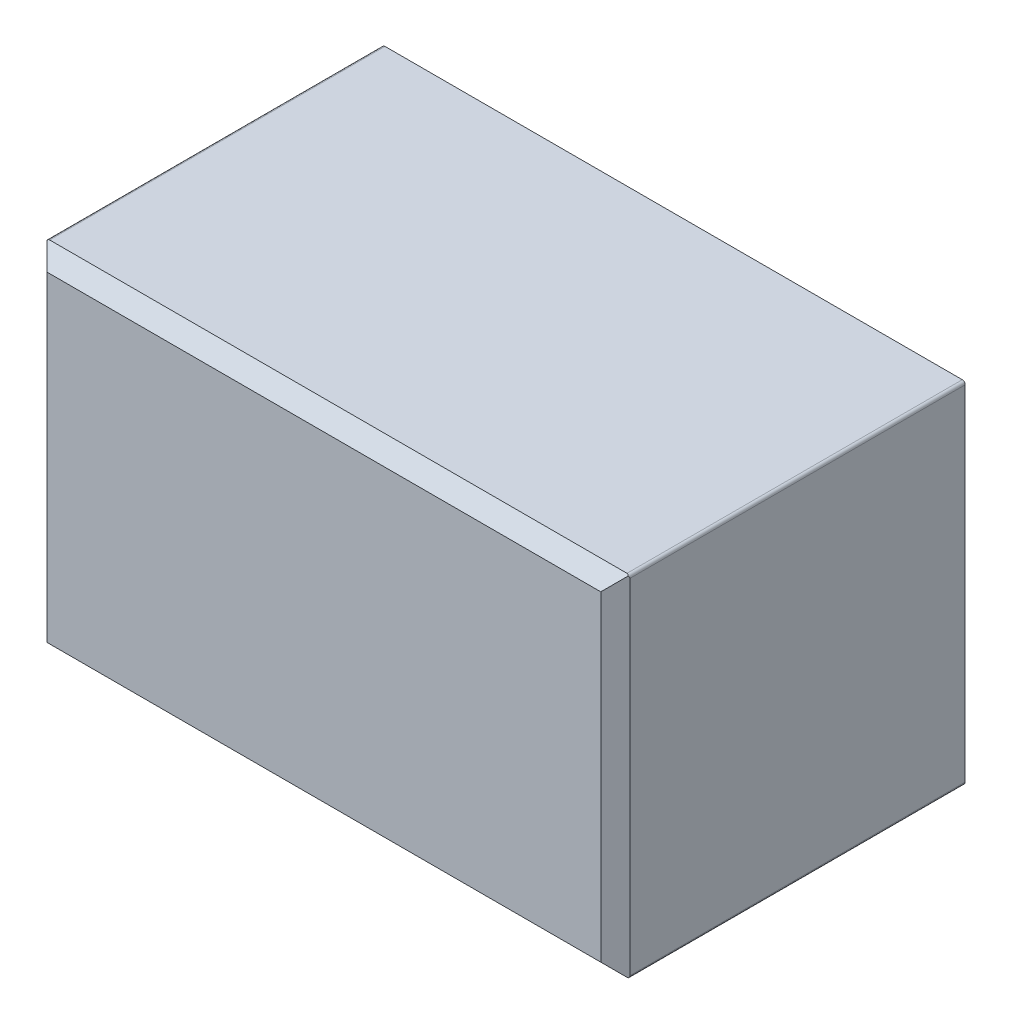
ISO-10303-21;
HEADER;
FILE_DESCRIPTION(('STEP AP214'),'2;1');
FILE_NAME('part.step','',(''),(''),'','','');
FILE_SCHEMA(('AUTOMOTIVE_DESIGN { 1 0 10303 214 1 1 1 1 }'));
ENDSEC;
DATA;
#1=APPLICATION_CONTEXT('core data for automotive mechanical design processes');
#2=APPLICATION_PROTOCOL_DEFINITION('international standard','automotive_design',2000,#1);
#3=PRODUCT_CONTEXT('',#1,'mechanical');
#4=PRODUCT('Part','Part','',(#3));
#5=PRODUCT_RELATED_PRODUCT_CATEGORY('part','',(#4));
#6=PRODUCT_DEFINITION_FORMATION('','',#4);
#7=PRODUCT_DEFINITION_CONTEXT('part definition',#1,'design');
#8=PRODUCT_DEFINITION('design','',#6,#7);
#9=PRODUCT_DEFINITION_SHAPE('','',#8);
#10=(LENGTH_UNIT() NAMED_UNIT(*) SI_UNIT(.MILLI.,.METRE.));
#11=(NAMED_UNIT(*) PLANE_ANGLE_UNIT() SI_UNIT($,.RADIAN.));
#12=(NAMED_UNIT(*) SI_UNIT($,.STERADIAN.) SOLID_ANGLE_UNIT());
#13=UNCERTAINTY_MEASURE_WITH_UNIT(LENGTH_MEASURE(1.E-05),#10,'distance_accuracy_value','');
#14=(GEOMETRIC_REPRESENTATION_CONTEXT(3) GLOBAL_UNCERTAINTY_ASSIGNED_CONTEXT((#13)) GLOBAL_UNIT_ASSIGNED_CONTEXT((#10,
#11,#12)) REPRESENTATION_CONTEXT('',''));
#15=CARTESIAN_POINT('',(0.,0.,0.));
#16=DIRECTION('',(0.,0.,1.));
#17=DIRECTION('',(1.,0.,0.));
#18=AXIS2_PLACEMENT_3D('',#15,#16,#17);
#19=CARTESIAN_POINT('',(-1.06842105263158,0.681578947368422,1.2));
#20=DIRECTION('',(1.,0.,0.));
#21=DIRECTION('',(0.,0.,-1.));
#22=AXIS2_PLACEMENT_3D('',#19,#20,#21);
#23=PLANE('',#22);
#24=DIRECTION('',(0.,1.,0.));
#25=VECTOR('',#24,1.);
#26=CARTESIAN_POINT('',(-1.06842105263158,0.681578947368422,1.15));
#27=LINE('',#26,#25);
#28=CARTESIAN_POINT('',(-1.06842105263158,-0.508421052631579,1.15));
#29=VERTEX_POINT('',#28);
#30=CARTESIAN_POINT('',(-1.06842105263158,0.671578947368422,1.15));
#31=VERTEX_POINT('',#30);
#32=EDGE_CURVE('E177',#29,#31,#27,.T.);
#33=ORIENTED_EDGE('',*,*,#32,.T.);
#34=DIRECTION('',(0.,0.,-1.));
#35=VECTOR('',#34,1.);
#36=CARTESIAN_POINT('',(-1.06842105263158,0.671578947368422,1.2));
#37=LINE('',#36,#35);
#38=CARTESIAN_POINT('',(-1.06842105263158,0.671578947368422,0.));
#39=VERTEX_POINT('',#38);
#40=EDGE_CURVE('E194',#31,#39,#37,.T.);
#41=ORIENTED_EDGE('',*,*,#40,.T.);
#42=DIRECTION('',(0.,-1.,0.));
#43=VECTOR('',#42,1.);
#44=CARTESIAN_POINT('',(-1.06842105263158,0.681578947368422,0.));
#45=LINE('',#44,#43);
#46=CARTESIAN_POINT('',(-1.06842105263158,-0.508421052631579,0.));
#47=VERTEX_POINT('',#46);
#48=EDGE_CURVE('E148',#39,#47,#45,.T.);
#49=ORIENTED_EDGE('',*,*,#48,.T.);
#50=DIRECTION('',(0.,0.,-1.));
#51=VECTOR('',#50,1.);
#52=CARTESIAN_POINT('',(-1.06842105263158,-0.508421052631579,1.2));
#53=LINE('',#52,#51);
#54=EDGE_CURVE('E184',#47,#29,#53,.F.);
#55=ORIENTED_EDGE('',*,*,#54,.T.);
#56=EDGE_LOOP('',(#33,#41,#49,#55));
#57=FACE_BOUND('',#56,.T.);
#58=ADVANCED_FACE('F39',(#57),#23,.F.);
#59=CARTESIAN_POINT('',(-1.06842105263158,-0.518421052631579,1.2));
#60=DIRECTION('',(0.,1.,0.));
#61=DIRECTION('',(0.,0.,1.));
#62=AXIS2_PLACEMENT_3D('',#59,#60,#61);
#63=PLANE('',#62);
#64=DIRECTION('',(1.,0.,0.));
#65=VECTOR('',#64,1.);
#66=CARTESIAN_POINT('',(-1.06842105263158,-0.518421052631579,0.));
#67=LINE('',#66,#65);
#68=CARTESIAN_POINT('',(-1.05842105263158,-0.518421052631579,0.));
#69=VERTEX_POINT('',#68);
#70=CARTESIAN_POINT('',(0.921578947368421,-0.518421052631579,0.));
#71=VERTEX_POINT('',#70);
#72=EDGE_CURVE('E250',#69,#71,#67,.T.);
#73=ORIENTED_EDGE('',*,*,#72,.T.);
#74=DIRECTION('',(0.,0.,-1.));
#75=VECTOR('',#74,1.);
#76=CARTESIAN_POINT('',(0.921578947368421,-0.518421052631579,1.2));
#77=LINE('',#76,#75);
#78=CARTESIAN_POINT('',(0.921578947368421,-0.518421052631579,1.15));
#79=VERTEX_POINT('',#78);
#80=EDGE_CURVE('E61',#71,#79,#77,.F.);
#81=ORIENTED_EDGE('',*,*,#80,.T.);
#82=DIRECTION('',(-1.,0.,0.));
#83=VECTOR('',#82,1.);
#84=CARTESIAN_POINT('',(-1.06842105263158,-0.518421052631579,1.15));
#85=LINE('',#84,#83);
#86=CARTESIAN_POINT('',(-1.05842105263158,-0.518421052631579,1.15));
#87=VERTEX_POINT('',#86);
#88=EDGE_CURVE('E181',#79,#87,#85,.T.);
#89=ORIENTED_EDGE('',*,*,#88,.T.);
#90=DIRECTION('',(0.,0.,-1.));
#91=VECTOR('',#90,1.);
#92=CARTESIAN_POINT('',(-1.05842105263158,-0.518421052631579,1.2));
#93=LINE('',#92,#91);
#94=EDGE_CURVE('E241',#87,#69,#93,.T.);
#95=ORIENTED_EDGE('',*,*,#94,.T.);
#96=EDGE_LOOP('',(#73,#81,#89,#95));
#97=FACE_BOUND('',#96,.T.);
#98=ADVANCED_FACE('F249',(#97),#63,.F.);
#99=CARTESIAN_POINT('',(0.931578947368421,0.681578947368422,1.2));
#100=DIRECTION('',(-1.,0.,0.));
#101=DIRECTION('',(0.,-1.,0.));
#102=AXIS2_PLACEMENT_3D('',#99,#100,#101);
#103=PLANE('',#102);
#104=DIRECTION('',(0.,1.,0.));
#105=VECTOR('',#104,1.);
#106=CARTESIAN_POINT('',(0.931578947368421,0.681578947368422,0.));
#107=LINE('',#106,#105);
#108=CARTESIAN_POINT('',(0.931578947368421,-0.508421052631579,0.));
#109=VERTEX_POINT('',#108);
#110=CARTESIAN_POINT('',(0.931578947368421,0.671578947368422,0.));
#111=VERTEX_POINT('',#110);
#112=EDGE_CURVE('E160',#109,#111,#107,.T.);
#113=ORIENTED_EDGE('',*,*,#112,.T.);
#114=DIRECTION('',(0.,0.,-1.));
#115=VECTOR('',#114,1.);
#116=CARTESIAN_POINT('',(0.931578947368421,0.671578947368422,1.2));
#117=LINE('',#116,#115);
#118=CARTESIAN_POINT('',(0.931578947368421,0.671578947368422,1.15));
#119=VERTEX_POINT('',#118);
#120=EDGE_CURVE('E232',#111,#119,#117,.F.);
#121=ORIENTED_EDGE('',*,*,#120,.T.);
#122=DIRECTION('',(0.,-1.,0.));
#123=VECTOR('',#122,1.);
#124=CARTESIAN_POINT('',(0.931578947368421,-0.518421052631579,1.15));
#125=LINE('',#124,#123);
#126=CARTESIAN_POINT('',(0.931578947368421,-0.508421052631579,1.15));
#127=VERTEX_POINT('',#126);
#128=EDGE_CURVE('E169',#119,#127,#125,.T.);
#129=ORIENTED_EDGE('',*,*,#128,.T.);
#130=DIRECTION('',(0.,0.,-1.));
#131=VECTOR('',#130,1.);
#132=CARTESIAN_POINT('',(0.931578947368421,-0.508421052631579,1.2));
#133=LINE('',#132,#131);
#134=EDGE_CURVE('E228',#127,#109,#133,.T.);
#135=ORIENTED_EDGE('',*,*,#134,.T.);
#136=EDGE_LOOP('',(#113,#121,#129,#135));
#137=FACE_BOUND('',#136,.T.);
#138=ADVANCED_FACE('F278',(#137),#103,.F.);
#139=CARTESIAN_POINT('',(-1.06842105263158,0.681578947368422,1.2));
#140=DIRECTION('',(0.,-1.,0.));
#141=DIRECTION('',(0.,0.,-1.));
#142=AXIS2_PLACEMENT_3D('',#139,#140,#141);
#143=PLANE('',#142);
#144=DIRECTION('',(-1.,0.,0.));
#145=VECTOR('',#144,1.);
#146=CARTESIAN_POINT('',(-1.06842105263158,0.681578947368422,0.));
#147=LINE('',#146,#145);
#148=CARTESIAN_POINT('',(0.921578947368421,0.681578947368422,0.));
#149=VERTEX_POINT('',#148);
#150=CARTESIAN_POINT('',(-1.05842105263158,0.681578947368422,0.));
#151=VERTEX_POINT('',#150);
#152=EDGE_CURVE('E156',#149,#151,#147,.T.);
#153=ORIENTED_EDGE('',*,*,#152,.T.);
#154=DIRECTION('',(0.,0.,-1.));
#155=VECTOR('',#154,1.);
#156=CARTESIAN_POINT('',(-1.05842105263158,0.681578947368422,1.2));
#157=LINE('',#156,#155);
#158=CARTESIAN_POINT('',(-1.05842105263158,0.681578947368422,1.15));
#159=VERTEX_POINT('',#158);
#160=EDGE_CURVE('E214',#151,#159,#157,.F.);
#161=ORIENTED_EDGE('',*,*,#160,.T.);
#162=DIRECTION('',(1.,0.,0.));
#163=VECTOR('',#162,1.);
#164=CARTESIAN_POINT('',(0.931578947368421,0.681578947368422,1.15));
#165=LINE('',#164,#163);
#166=CARTESIAN_POINT('',(0.921578947368421,0.681578947368422,1.15));
#167=VERTEX_POINT('',#166);
#168=EDGE_CURVE('E173',#159,#167,#165,.T.);
#169=ORIENTED_EDGE('',*,*,#168,.T.);
#170=DIRECTION('',(0.,0.,-1.));
#171=VECTOR('',#170,1.);
#172=CARTESIAN_POINT('',(0.921578947368421,0.681578947368422,1.2));
#173=LINE('',#172,#171);
#174=EDGE_CURVE('E210',#167,#149,#173,.T.);
#175=ORIENTED_EDGE('',*,*,#174,.T.);
#176=EDGE_LOOP('',(#153,#161,#169,#175));
#177=FACE_BOUND('',#176,.T.);
#178=ADVANCED_FACE('F315',(#177),#143,.F.);
#179=CARTESIAN_POINT('',(0.,0.,1.2));
#180=DIRECTION('',(0.,0.,1.));
#181=DIRECTION('',(1.,0.,0.));
#182=AXIS2_PLACEMENT_3D('',#179,#180,#181);
#183=PLANE('',#182);
#184=DIRECTION('',(1.,0.,0.));
#185=VECTOR('',#184,1.);
#186=CARTESIAN_POINT('',(0.931578947368421,-0.468421052631579,1.2));
#187=LINE('',#186,#185);
#188=CARTESIAN_POINT('',(-1.01842105263158,-0.468421052631579,1.2));
#189=VERTEX_POINT('',#188);
#190=CARTESIAN_POINT('',(0.881578947368421,-0.468421052631579,1.2));
#191=VERTEX_POINT('',#190);
#192=EDGE_CURVE('E134',#189,#191,#187,.T.);
#193=ORIENTED_EDGE('',*,*,#192,.T.);
#194=DIRECTION('',(0.,1.,0.));
#195=VECTOR('',#194,1.);
#196=CARTESIAN_POINT('',(0.881578947368421,0.681578947368422,1.2));
#197=LINE('',#196,#195);
#198=CARTESIAN_POINT('',(0.881578947368421,0.631578947368422,1.2));
#199=VERTEX_POINT('',#198);
#200=EDGE_CURVE('E166',#191,#199,#197,.T.);
#201=ORIENTED_EDGE('',*,*,#200,.T.);
#202=DIRECTION('',(-1.,0.,0.));
#203=VECTOR('',#202,1.);
#204=CARTESIAN_POINT('',(-1.06842105263158,0.631578947368422,1.2));
#205=LINE('',#204,#203);
#206=CARTESIAN_POINT('',(-1.01842105263158,0.631578947368422,1.2));
#207=VERTEX_POINT('',#206);
#208=EDGE_CURVE('E137',#199,#207,#205,.T.);
#209=ORIENTED_EDGE('',*,*,#208,.T.);
#210=DIRECTION('',(0.,-1.,0.));
#211=VECTOR('',#210,1.);
#212=CARTESIAN_POINT('',(-1.01842105263158,-0.518421052631579,1.2));
#213=LINE('',#212,#211);
#214=EDGE_CURVE('E129',#207,#189,#213,.T.);
#215=ORIENTED_EDGE('',*,*,#214,.T.);
#216=EDGE_LOOP('',(#193,#201,#209,#215));
#217=FACE_BOUND('',#216,.T.);
#218=ADVANCED_FACE('F131',(#217),#183,.T.);
#219=CARTESIAN_POINT('',(0.,0.,0.));
#220=DIRECTION('',(0.,0.,1.));
#221=DIRECTION('',(1.,0.,0.));
#222=AXIS2_PLACEMENT_3D('',#219,#220,#221);
#223=PLANE('',#222);
#224=ORIENTED_EDGE('',*,*,#48,.F.);
#225=CARTESIAN_POINT('',(-1.05842105263158,0.671578947368422,0.));
#226=DIRECTION('',(0.,0.,1.));
#227=DIRECTION('',(1.,0.,0.));
#228=AXIS2_PLACEMENT_3D('',#225,#226,#227);
#229=CIRCLE('',#228,0.01);
#230=EDGE_CURVE('E207',#39,#151,#229,.F.);
#231=ORIENTED_EDGE('',*,*,#230,.T.);
#232=ORIENTED_EDGE('',*,*,#152,.F.);
#233=CARTESIAN_POINT('',(0.921578947368421,0.671578947368422,0.));
#234=DIRECTION('',(0.,0.,1.));
#235=DIRECTION('',(1.,0.,0.));
#236=AXIS2_PLACEMENT_3D('',#233,#234,#235);
#237=CIRCLE('',#236,0.01);
#238=EDGE_CURVE('E204',#149,#111,#237,.F.);
#239=ORIENTED_EDGE('',*,*,#238,.T.);
#240=ORIENTED_EDGE('',*,*,#112,.F.);
#241=CARTESIAN_POINT('',(0.921578947368421,-0.508421052631579,0.));
#242=DIRECTION('',(0.,0.,1.));
#243=DIRECTION('',(1.,0.,0.));
#244=AXIS2_PLACEMENT_3D('',#241,#242,#243);
#245=CIRCLE('',#244,0.01);
#246=EDGE_CURVE('E201',#109,#71,#245,.F.);
#247=ORIENTED_EDGE('',*,*,#246,.T.);
#248=ORIENTED_EDGE('',*,*,#72,.F.);
#249=CARTESIAN_POINT('',(-1.05842105263158,-0.508421052631579,0.));
#250=DIRECTION('',(0.,0.,1.));
#251=DIRECTION('',(1.,0.,0.));
#252=AXIS2_PLACEMENT_3D('',#249,#250,#251);
#253=CIRCLE('',#252,0.01);
#254=EDGE_CURVE('E198',#69,#47,#253,.F.);
#255=ORIENTED_EDGE('',*,*,#254,.T.);
#256=EDGE_LOOP('',(#224,#231,#232,#239,#240,#247,#248,#255));
#257=FACE_BOUND('',#256,.T.);
#258=ADVANCED_FACE('F254',(#257),#223,.F.);
#259=CARTESIAN_POINT('',(-1.01842105263158,0.,1.2));
#260=DIRECTION('',(-0.707106781186551,0.,0.707106781186544));
#261=DIRECTION('',(0.,1.,0.));
#262=AXIS2_PLACEMENT_3D('',#259,#260,#261);
#263=PLANE('',#262);
#264=DIRECTION('',(-0.577350269189624,0.577350269189624,-0.577350269189629));
#265=VECTOR('',#264,1.);
#266=CARTESIAN_POINT('',(-0.807894736842106,0.421052631578949,1.41052631578947));
#267=LINE('',#266,#265);
#268=CARTESIAN_POINT('',(-1.06549212044344,0.678650015180287,1.15292893218813));
#269=VERTEX_POINT('',#268);
#270=EDGE_CURVE('E149',#269,#207,#267,.F.);
#271=ORIENTED_EDGE('',*,*,#270,.F.);
#272=CARTESIAN_POINT('',(-1.05842105263158,0.671578947368422,1.16));
#273=DIRECTION('',(-0.707106781186551,0.,0.707106781186544));
#274=DIRECTION('',(-0.707106781186544,0.,-0.707106781186551));
#275=AXIS2_PLACEMENT_3D('',#272,#273,#274);
#276=ELLIPSE('',#275,0.014142135623731,0.01);
#277=EDGE_CURVE('E225',#269,#31,#276,.T.);
#278=ORIENTED_EDGE('',*,*,#277,.T.);
#279=ORIENTED_EDGE('',*,*,#32,.F.);
#280=CARTESIAN_POINT('',(-1.05842105263158,-0.508421052631579,1.16));
#281=DIRECTION('',(-0.707106781186551,0.,0.707106781186544));
#282=DIRECTION('',(-0.707106781186544,0.,-0.707106781186551));
#283=AXIS2_PLACEMENT_3D('',#280,#281,#282);
#284=ELLIPSE('',#283,0.014142135623731,0.01);
#285=CARTESIAN_POINT('',(-1.06549212044344,-0.515492120443444,1.15292893218813));
#286=VERTEX_POINT('',#285);
#287=EDGE_CURVE('E146',#29,#286,#284,.T.);
#288=ORIENTED_EDGE('',*,*,#287,.T.);
#289=DIRECTION('',(-0.577350269189624,-0.577350269189624,-0.577350269189629));
#290=VECTOR('',#289,1.);
#291=CARTESIAN_POINT('',(-0.678947368421054,-0.128947368421054,1.53947368421053));
#292=LINE('',#291,#290);
#293=EDGE_CURVE('E142',#189,#286,#292,.T.);
#294=ORIENTED_EDGE('',*,*,#293,.F.);
#295=ORIENTED_EDGE('',*,*,#214,.F.);
#296=EDGE_LOOP('',(#271,#278,#279,#288,#294,#295));
#297=FACE_BOUND('',#296,.T.);
#298=ADVANCED_FACE('F143',(#297),#263,.T.);
#299=CARTESIAN_POINT('',(0.,-0.468421052631579,1.2));
#300=DIRECTION('',(0.,-0.707106781186551,0.707106781186544));
#301=DIRECTION('',(-1.,0.,0.));
#302=AXIS2_PLACEMENT_3D('',#299,#300,#301);
#303=PLANE('',#302);
#304=ORIENTED_EDGE('',*,*,#88,.F.);
#305=CARTESIAN_POINT('',(0.921578947368421,-0.508421052631579,1.16));
#306=DIRECTION('',(0.,-0.707106781186551,0.707106781186544));
#307=DIRECTION('',(0.,-0.707106781186544,-0.707106781186551));
#308=AXIS2_PLACEMENT_3D('',#305,#306,#307);
#309=ELLIPSE('',#308,0.014142135623731,0.01);
#310=CARTESIAN_POINT('',(0.928650015180287,-0.515492120443444,1.15292893218813));
#311=VERTEX_POINT('',#310);
#312=EDGE_CURVE('E11',#79,#311,#309,.T.);
#313=ORIENTED_EDGE('',*,*,#312,.T.);
#314=DIRECTION('',(-0.577350269189625,0.577350269189624,0.577350269189629));
#315=VECTOR('',#314,1.);
#316=CARTESIAN_POINT('',(0.587719298245616,-0.174561403508773,1.49385964912281));
#317=LINE('',#316,#315);
#318=EDGE_CURVE('E153',#191,#311,#317,.F.);
#319=ORIENTED_EDGE('',*,*,#318,.F.);
#320=ORIENTED_EDGE('',*,*,#192,.F.);
#321=ORIENTED_EDGE('',*,*,#293,.T.);
#322=CARTESIAN_POINT('',(-1.05842105263158,-0.508421052631579,1.16));
#323=DIRECTION('',(0.,-0.707106781186551,0.707106781186544));
#324=DIRECTION('',(0.,-0.707106781186544,-0.707106781186551));
#325=AXIS2_PLACEMENT_3D('',#322,#323,#324);
#326=ELLIPSE('',#325,0.014142135623731,0.01);
#327=EDGE_CURVE('E48',#286,#87,#326,.T.);
#328=ORIENTED_EDGE('',*,*,#327,.T.);
#329=EDGE_LOOP('',(#304,#313,#319,#320,#321,#328));
#330=FACE_BOUND('',#329,.T.);
#331=ADVANCED_FACE('F151',(#330),#303,.T.);
#332=CARTESIAN_POINT('',(0.,0.631578947368422,1.2));
#333=DIRECTION('',(0.,0.707106781186551,0.707106781186544));
#334=DIRECTION('',(1.,0.,0.));
#335=AXIS2_PLACEMENT_3D('',#332,#333,#334);
#336=PLANE('',#335);
#337=ORIENTED_EDGE('',*,*,#168,.F.);
#338=CARTESIAN_POINT('',(-1.05842105263158,0.671578947368422,1.16));
#339=DIRECTION('',(0.,0.707106781186551,0.707106781186544));
#340=DIRECTION('',(0.,0.707106781186544,-0.707106781186551));
#341=AXIS2_PLACEMENT_3D('',#338,#339,#340);
#342=ELLIPSE('',#341,0.014142135623731,0.01);
#343=EDGE_CURVE('E220',#159,#269,#342,.T.);
#344=ORIENTED_EDGE('',*,*,#343,.T.);
#345=ORIENTED_EDGE('',*,*,#270,.T.);
#346=ORIENTED_EDGE('',*,*,#208,.F.);
#347=DIRECTION('',(0.577350269189625,0.577350269189624,-0.577350269189629));
#348=VECTOR('',#347,1.);
#349=CARTESIAN_POINT('',(0.587719298245616,0.337719298245617,1.49385964912281));
#350=LINE('',#349,#348);
#351=CARTESIAN_POINT('',(0.928650015180287,0.678650015180288,1.15292893218813));
#352=VERTEX_POINT('',#351);
#353=EDGE_CURVE('E185',#352,#199,#350,.F.);
#354=ORIENTED_EDGE('',*,*,#353,.F.);
#355=CARTESIAN_POINT('',(0.921578947368421,0.671578947368422,1.16));
#356=DIRECTION('',(0.,0.707106781186551,0.707106781186544));
#357=DIRECTION('',(0.,0.707106781186544,-0.707106781186551));
#358=AXIS2_PLACEMENT_3D('',#355,#356,#357);
#359=ELLIPSE('',#358,0.014142135623731,0.01);
#360=EDGE_CURVE('E217',#352,#167,#359,.T.);
#361=ORIENTED_EDGE('',*,*,#360,.T.);
#362=EDGE_LOOP('',(#337,#344,#345,#346,#354,#361));
#363=FACE_BOUND('',#362,.T.);
#364=ADVANCED_FACE('F286',(#363),#336,.T.);
#365=CARTESIAN_POINT('',(0.881578947368421,0.,1.2));
#366=DIRECTION('',(0.70710678118655,0.,0.707106781186545));
#367=DIRECTION('',(0.,-1.,0.));
#368=AXIS2_PLACEMENT_3D('',#365,#366,#367);
#369=PLANE('',#368);
#370=ORIENTED_EDGE('',*,*,#128,.F.);
#371=CARTESIAN_POINT('',(0.921578947368421,0.671578947368422,1.16));
#372=DIRECTION('',(0.70710678118655,0.,0.707106781186545));
#373=DIRECTION('',(0.707106781186545,0.,-0.70710678118655));
#374=AXIS2_PLACEMENT_3D('',#371,#372,#373);
#375=ELLIPSE('',#374,0.014142135623731,0.01);
#376=EDGE_CURVE('E238',#119,#352,#375,.T.);
#377=ORIENTED_EDGE('',*,*,#376,.T.);
#378=ORIENTED_EDGE('',*,*,#353,.T.);
#379=ORIENTED_EDGE('',*,*,#200,.F.);
#380=ORIENTED_EDGE('',*,*,#318,.T.);
#381=CARTESIAN_POINT('',(0.921578947368421,-0.508421052631579,1.16));
#382=DIRECTION('',(0.70710678118655,0.,0.707106781186545));
#383=DIRECTION('',(0.707106781186545,0.,-0.70710678118655));
#384=AXIS2_PLACEMENT_3D('',#381,#382,#383);
#385=ELLIPSE('',#384,0.014142135623731,0.01);
#386=EDGE_CURVE('E235',#311,#127,#385,.T.);
#387=ORIENTED_EDGE('',*,*,#386,.T.);
#388=EDGE_LOOP('',(#370,#377,#378,#379,#380,#387));
#389=FACE_BOUND('',#388,.T.);
#390=ADVANCED_FACE('F282',(#389),#369,.T.);
#391=CARTESIAN_POINT('',(-1.05842105263158,0.671578947368422,1.2));
#392=DIRECTION('',(0.,0.,-1.));
#393=DIRECTION('',(-1.,0.,0.));
#394=AXIS2_PLACEMENT_3D('',#391,#392,#393);
#395=CYLINDRICAL_SURFACE('',#394,0.01);
#396=ORIENTED_EDGE('',*,*,#343,.F.);
#397=ORIENTED_EDGE('',*,*,#160,.F.);
#398=ORIENTED_EDGE('',*,*,#230,.F.);
#399=ORIENTED_EDGE('',*,*,#40,.F.);
#400=ORIENTED_EDGE('',*,*,#277,.F.);
#401=EDGE_LOOP('',(#396,#397,#398,#399,#400));
#402=FACE_BOUND('',#401,.T.);
#403=ADVANCED_FACE('F285',(#402),#395,.T.);
#404=CARTESIAN_POINT('',(0.921578947368421,0.671578947368422,1.2));
#405=DIRECTION('',(0.,0.,-1.));
#406=DIRECTION('',(-1.,0.,0.));
#407=AXIS2_PLACEMENT_3D('',#404,#405,#406);
#408=CYLINDRICAL_SURFACE('',#407,0.01);
#409=ORIENTED_EDGE('',*,*,#376,.F.);
#410=ORIENTED_EDGE('',*,*,#120,.F.);
#411=ORIENTED_EDGE('',*,*,#238,.F.);
#412=ORIENTED_EDGE('',*,*,#174,.F.);
#413=ORIENTED_EDGE('',*,*,#360,.F.);
#414=EDGE_LOOP('',(#409,#410,#411,#412,#413));
#415=FACE_BOUND('',#414,.T.);
#416=ADVANCED_FACE('F271',(#415),#408,.T.);
#417=CARTESIAN_POINT('',(0.921578947368421,-0.508421052631579,1.2));
#418=DIRECTION('',(0.,0.,-1.));
#419=DIRECTION('',(-1.,0.,0.));
#420=AXIS2_PLACEMENT_3D('',#417,#418,#419);
#421=CYLINDRICAL_SURFACE('',#420,0.01);
#422=ORIENTED_EDGE('',*,*,#312,.F.);
#423=ORIENTED_EDGE('',*,*,#80,.F.);
#424=ORIENTED_EDGE('',*,*,#246,.F.);
#425=ORIENTED_EDGE('',*,*,#134,.F.);
#426=ORIENTED_EDGE('',*,*,#386,.F.);
#427=EDGE_LOOP('',(#422,#423,#424,#425,#426));
#428=FACE_BOUND('',#427,.T.);
#429=ADVANCED_FACE('F267',(#428),#421,.T.);
#430=CARTESIAN_POINT('',(-1.05842105263158,-0.508421052631579,1.2));
#431=DIRECTION('',(0.,0.,-1.));
#432=DIRECTION('',(-1.,0.,0.));
#433=AXIS2_PLACEMENT_3D('',#430,#431,#432);
#434=CYLINDRICAL_SURFACE('',#433,0.01);
#435=ORIENTED_EDGE('',*,*,#287,.F.);
#436=ORIENTED_EDGE('',*,*,#54,.F.);
#437=ORIENTED_EDGE('',*,*,#254,.F.);
#438=ORIENTED_EDGE('',*,*,#94,.F.);
#439=ORIENTED_EDGE('',*,*,#327,.F.);
#440=EDGE_LOOP('',(#435,#436,#437,#438,#439));
#441=FACE_BOUND('',#440,.T.);
#442=ADVANCED_FACE('F41',(#441),#434,.T.);
#443=CLOSED_SHELL('',(#58,#98,#138,#178,#218,#258,#298,#331,#364,#390,#403,#416,#429,#442));
#444=MANIFOLD_SOLID_BREP('B2',#443);
#445=ADVANCED_BREP_SHAPE_REPRESENTATION('',(#18,#444),#14);
#446=SHAPE_DEFINITION_REPRESENTATION(#9,#445);
ENDSEC;
END-ISO-10303-21;
